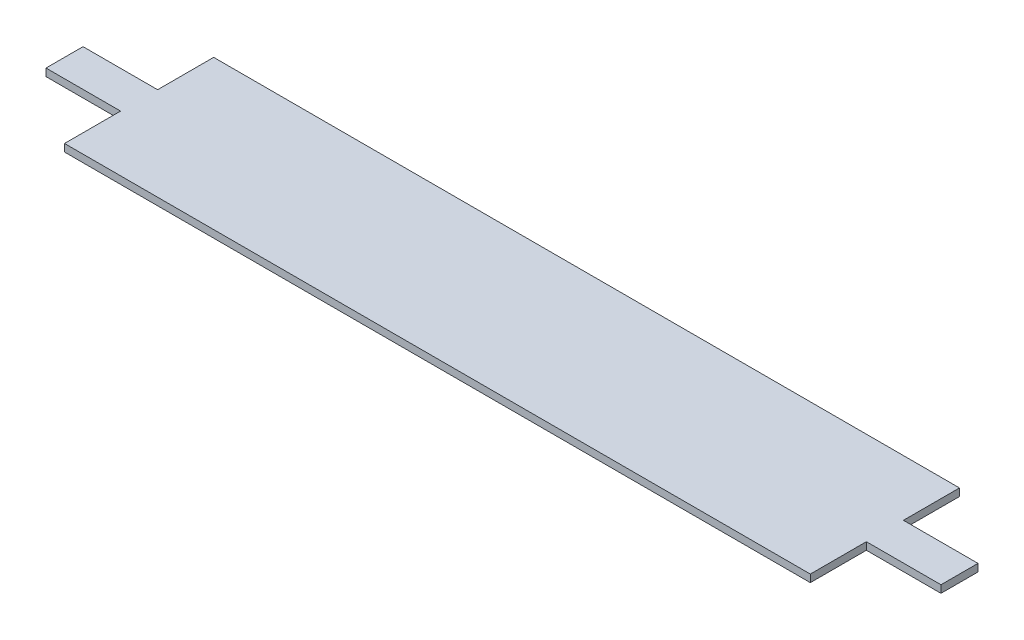
ISO-10303-21;
HEADER;
FILE_DESCRIPTION(('STEP AP214'),'2;1');
FILE_NAME('part.step','',(''),(''),'','','');
FILE_SCHEMA(('AUTOMOTIVE_DESIGN { 1 0 10303 214 1 1 1 1 }'));
ENDSEC;
DATA;
#1=APPLICATION_CONTEXT('core data for automotive mechanical design processes');
#2=APPLICATION_PROTOCOL_DEFINITION('international standard','automotive_design',2000,#1);
#3=PRODUCT_CONTEXT('',#1,'mechanical');
#4=PRODUCT('Part','Part','',(#3));
#5=PRODUCT_RELATED_PRODUCT_CATEGORY('part','',(#4));
#6=PRODUCT_DEFINITION_FORMATION('','',#4);
#7=PRODUCT_DEFINITION_CONTEXT('part definition',#1,'design');
#8=PRODUCT_DEFINITION('design','',#6,#7);
#9=PRODUCT_DEFINITION_SHAPE('','',#8);
#10=(LENGTH_UNIT() NAMED_UNIT(*) SI_UNIT(.MILLI.,.METRE.));
#11=(NAMED_UNIT(*) PLANE_ANGLE_UNIT() SI_UNIT($,.RADIAN.));
#12=(NAMED_UNIT(*) SI_UNIT($,.STERADIAN.) SOLID_ANGLE_UNIT());
#13=UNCERTAINTY_MEASURE_WITH_UNIT(LENGTH_MEASURE(1.E-05),#10,'distance_accuracy_value','');
#14=(GEOMETRIC_REPRESENTATION_CONTEXT(3) GLOBAL_UNCERTAINTY_ASSIGNED_CONTEXT((#13)) GLOBAL_UNIT_ASSIGNED_CONTEXT((#10,
#11,#12)) REPRESENTATION_CONTEXT('',''));
#15=CARTESIAN_POINT('',(0.,0.,0.));
#16=DIRECTION('',(0.,0.,1.));
#17=DIRECTION('',(1.,0.,0.));
#18=AXIS2_PLACEMENT_3D('',#15,#16,#17);
#19=CARTESIAN_POINT('',(25.,0.5,-5.));
#20=DIRECTION('',(0.,0.,1.));
#21=DIRECTION('',(1.,0.,0.));
#22=AXIS2_PLACEMENT_3D('',#19,#20,#21);
#23=PLANE('',#22);
#24=DIRECTION('',(-1.,0.,0.));
#25=VECTOR('',#24,1.);
#26=CARTESIAN_POINT('',(25.,0.,-5.));
#27=LINE('',#26,#25);
#28=CARTESIAN_POINT('',(25.,0.,-5.));
#29=VERTEX_POINT('',#28);
#30=CARTESIAN_POINT('',(-25.,0.,-4.99999999999999));
#31=VERTEX_POINT('',#30);
#32=EDGE_CURVE('E153',#29,#31,#27,.T.);
#33=ORIENTED_EDGE('',*,*,#32,.T.);
#34=DIRECTION('',(0.,-1.,0.));
#35=VECTOR('',#34,1.);
#36=CARTESIAN_POINT('',(-25.,0.5,-4.99999999999999));
#37=LINE('',#36,#35);
#38=CARTESIAN_POINT('',(-25.,0.5,-4.99999999999999));
#39=VERTEX_POINT('',#38);
#40=EDGE_CURVE('E11',#39,#31,#37,.T.);
#41=ORIENTED_EDGE('',*,*,#40,.F.);
#42=DIRECTION('',(-1.,0.,0.));
#43=VECTOR('',#42,1.);
#44=CARTESIAN_POINT('',(25.,0.5,-5.));
#45=LINE('',#44,#43);
#46=CARTESIAN_POINT('',(25.,0.5,-5.));
#47=VERTEX_POINT('',#46);
#48=EDGE_CURVE('E175',#47,#39,#45,.T.);
#49=ORIENTED_EDGE('',*,*,#48,.F.);
#50=DIRECTION('',(0.,-1.,0.));
#51=VECTOR('',#50,1.);
#52=CARTESIAN_POINT('',(25.,0.5,-5.));
#53=LINE('',#52,#51);
#54=EDGE_CURVE('E149',#47,#29,#53,.T.);
#55=ORIENTED_EDGE('',*,*,#54,.T.);
#56=EDGE_LOOP('',(#33,#41,#49,#55));
#57=FACE_BOUND('',#56,.T.);
#58=ADVANCED_FACE('F33',(#57),#23,.F.);
#59=CARTESIAN_POINT('',(-25.,0.5,-1.24120089325405));
#60=DIRECTION('',(1.,0.,0.));
#61=DIRECTION('',(0.,0.,-1.));
#62=AXIS2_PLACEMENT_3D('',#59,#60,#61);
#63=PLANE('',#62);
#64=DIRECTION('',(0.,0.,1.));
#65=VECTOR('',#64,1.);
#66=CARTESIAN_POINT('',(-25.,0.,-1.24120089325405));
#67=LINE('',#66,#65);
#68=CARTESIAN_POINT('',(-25.,0.,-1.24120089325405));
#69=VERTEX_POINT('',#68);
#70=EDGE_CURVE('E156',#31,#69,#67,.T.);
#71=ORIENTED_EDGE('',*,*,#70,.T.);
#72=DIRECTION('',(0.,-1.,0.));
#73=VECTOR('',#72,1.);
#74=CARTESIAN_POINT('',(-25.,0.5,-1.24120089325405));
#75=LINE('',#74,#73);
#76=CARTESIAN_POINT('',(-25.,0.5,-1.24120089325405));
#77=VERTEX_POINT('',#76);
#78=EDGE_CURVE('E41',#77,#69,#75,.T.);
#79=ORIENTED_EDGE('',*,*,#78,.F.);
#80=DIRECTION('',(0.,0.,1.));
#81=VECTOR('',#80,1.);
#82=CARTESIAN_POINT('',(-25.,0.5,-1.24120089325405));
#83=LINE('',#82,#81);
#84=EDGE_CURVE('E104',#39,#77,#83,.T.);
#85=ORIENTED_EDGE('',*,*,#84,.F.);
#86=ORIENTED_EDGE('',*,*,#40,.T.);
#87=EDGE_LOOP('',(#71,#79,#85,#86));
#88=FACE_BOUND('',#87,.T.);
#89=ADVANCED_FACE('F253',(#88),#63,.F.);
#90=CARTESIAN_POINT('',(-30.,0.5,-1.24120089325405));
#91=DIRECTION('',(0.,0.,1.));
#92=DIRECTION('',(1.,0.,0.));
#93=AXIS2_PLACEMENT_3D('',#90,#91,#92);
#94=PLANE('',#93);
#95=DIRECTION('',(-1.,0.,0.));
#96=VECTOR('',#95,1.);
#97=CARTESIAN_POINT('',(-30.,0.,-1.24120089325405));
#98=LINE('',#97,#96);
#99=CARTESIAN_POINT('',(-30.,0.,-1.24120089325405));
#100=VERTEX_POINT('',#99);
#101=EDGE_CURVE('E158',#69,#100,#98,.T.);
#102=ORIENTED_EDGE('',*,*,#101,.T.);
#103=DIRECTION('',(0.,-1.,0.));
#104=VECTOR('',#103,1.);
#105=CARTESIAN_POINT('',(-30.,0.5,-1.24120089325405));
#106=LINE('',#105,#104);
#107=CARTESIAN_POINT('',(-30.,0.5,-1.24120089325405));
#108=VERTEX_POINT('',#107);
#109=EDGE_CURVE('E194',#108,#100,#106,.T.);
#110=ORIENTED_EDGE('',*,*,#109,.F.);
#111=DIRECTION('',(-1.,0.,0.));
#112=VECTOR('',#111,1.);
#113=CARTESIAN_POINT('',(-30.,0.5,-1.24120089325405));
#114=LINE('',#113,#112);
#115=EDGE_CURVE('E202',#77,#108,#114,.T.);
#116=ORIENTED_EDGE('',*,*,#115,.F.);
#117=ORIENTED_EDGE('',*,*,#78,.T.);
#118=EDGE_LOOP('',(#102,#110,#116,#117));
#119=FACE_BOUND('',#118,.T.);
#120=ADVANCED_FACE('F200',(#119),#94,.F.);
#121=CARTESIAN_POINT('',(-30.,0.5,1.24120089325406));
#122=DIRECTION('',(1.,0.,0.));
#123=DIRECTION('',(0.,0.,-1.));
#124=AXIS2_PLACEMENT_3D('',#121,#122,#123);
#125=PLANE('',#124);
#126=DIRECTION('',(0.,0.,1.));
#127=VECTOR('',#126,1.);
#128=CARTESIAN_POINT('',(-30.,0.,1.24120089325406));
#129=LINE('',#128,#127);
#130=CARTESIAN_POINT('',(-30.,0.,1.24120089325406));
#131=VERTEX_POINT('',#130);
#132=EDGE_CURVE('E160',#100,#131,#129,.T.);
#133=ORIENTED_EDGE('',*,*,#132,.T.);
#134=DIRECTION('',(0.,-1.,0.));
#135=VECTOR('',#134,1.);
#136=CARTESIAN_POINT('',(-30.,0.5,1.24120089325406));
#137=LINE('',#136,#135);
#138=CARTESIAN_POINT('',(-30.,0.5,1.24120089325406));
#139=VERTEX_POINT('',#138);
#140=EDGE_CURVE('E191',#139,#131,#137,.T.);
#141=ORIENTED_EDGE('',*,*,#140,.F.);
#142=DIRECTION('',(0.,0.,1.));
#143=VECTOR('',#142,1.);
#144=CARTESIAN_POINT('',(-30.,0.5,1.24120089325406));
#145=LINE('',#144,#143);
#146=EDGE_CURVE('E220',#108,#139,#145,.T.);
#147=ORIENTED_EDGE('',*,*,#146,.F.);
#148=ORIENTED_EDGE('',*,*,#109,.T.);
#149=EDGE_LOOP('',(#133,#141,#147,#148));
#150=FACE_BOUND('',#149,.T.);
#151=ADVANCED_FACE('F211',(#150),#125,.F.);
#152=CARTESIAN_POINT('',(-30.,0.5,1.24120089325406));
#153=DIRECTION('',(0.,0.,-1.));
#154=DIRECTION('',(-1.,0.,0.));
#155=AXIS2_PLACEMENT_3D('',#152,#153,#154);
#156=PLANE('',#155);
#157=DIRECTION('',(1.,0.,0.));
#158=VECTOR('',#157,1.);
#159=CARTESIAN_POINT('',(-30.,0.,1.24120089325406));
#160=LINE('',#159,#158);
#161=CARTESIAN_POINT('',(-25.,0.,1.24120089325406));
#162=VERTEX_POINT('',#161);
#163=EDGE_CURVE('E162',#131,#162,#160,.T.);
#164=ORIENTED_EDGE('',*,*,#163,.T.);
#165=DIRECTION('',(0.,-1.,0.));
#166=VECTOR('',#165,1.);
#167=CARTESIAN_POINT('',(-25.,0.5,1.24120089325406));
#168=LINE('',#167,#166);
#169=CARTESIAN_POINT('',(-25.,0.5,1.24120089325406));
#170=VERTEX_POINT('',#169);
#171=EDGE_CURVE('E188',#170,#162,#168,.T.);
#172=ORIENTED_EDGE('',*,*,#171,.F.);
#173=DIRECTION('',(1.,0.,0.));
#174=VECTOR('',#173,1.);
#175=CARTESIAN_POINT('',(-30.,0.5,1.24120089325406));
#176=LINE('',#175,#174);
#177=EDGE_CURVE('E217',#139,#170,#176,.T.);
#178=ORIENTED_EDGE('',*,*,#177,.F.);
#179=ORIENTED_EDGE('',*,*,#140,.T.);
#180=EDGE_LOOP('',(#164,#172,#178,#179));
#181=FACE_BOUND('',#180,.T.);
#182=ADVANCED_FACE('F215',(#181),#156,.F.);
#183=CARTESIAN_POINT('',(-25.,0.5,5.));
#184=DIRECTION('',(1.,0.,0.));
#185=DIRECTION('',(0.,0.,-1.));
#186=AXIS2_PLACEMENT_3D('',#183,#184,#185);
#187=PLANE('',#186);
#188=DIRECTION('',(0.,0.,1.));
#189=VECTOR('',#188,1.);
#190=CARTESIAN_POINT('',(-25.,0.,5.));
#191=LINE('',#190,#189);
#192=CARTESIAN_POINT('',(-25.,0.,5.));
#193=VERTEX_POINT('',#192);
#194=EDGE_CURVE('E164',#162,#193,#191,.T.);
#195=ORIENTED_EDGE('',*,*,#194,.T.);
#196=DIRECTION('',(0.,-1.,0.));
#197=VECTOR('',#196,1.);
#198=CARTESIAN_POINT('',(-25.,0.5,5.));
#199=LINE('',#198,#197);
#200=CARTESIAN_POINT('',(-25.,0.5,5.));
#201=VERTEX_POINT('',#200);
#202=EDGE_CURVE('E185',#201,#193,#199,.T.);
#203=ORIENTED_EDGE('',*,*,#202,.F.);
#204=DIRECTION('',(0.,0.,1.));
#205=VECTOR('',#204,1.);
#206=CARTESIAN_POINT('',(-25.,0.5,5.));
#207=LINE('',#206,#205);
#208=EDGE_CURVE('E219',#170,#201,#207,.T.);
#209=ORIENTED_EDGE('',*,*,#208,.F.);
#210=ORIENTED_EDGE('',*,*,#171,.T.);
#211=EDGE_LOOP('',(#195,#203,#209,#210));
#212=FACE_BOUND('',#211,.T.);
#213=ADVANCED_FACE('F266',(#212),#187,.F.);
#214=CARTESIAN_POINT('',(25.,0.5,5.));
#215=DIRECTION('',(0.,0.,-1.));
#216=DIRECTION('',(-1.,0.,0.));
#217=AXIS2_PLACEMENT_3D('',#214,#215,#216);
#218=PLANE('',#217);
#219=DIRECTION('',(1.,0.,0.));
#220=VECTOR('',#219,1.);
#221=CARTESIAN_POINT('',(25.,0.,5.));
#222=LINE('',#221,#220);
#223=CARTESIAN_POINT('',(25.,0.,5.));
#224=VERTEX_POINT('',#223);
#225=EDGE_CURVE('E166',#193,#224,#222,.T.);
#226=ORIENTED_EDGE('',*,*,#225,.T.);
#227=DIRECTION('',(0.,-1.,0.));
#228=VECTOR('',#227,1.);
#229=CARTESIAN_POINT('',(25.,0.5,5.));
#230=LINE('',#229,#228);
#231=CARTESIAN_POINT('',(25.,0.5,5.));
#232=VERTEX_POINT('',#231);
#233=EDGE_CURVE('E182',#232,#224,#230,.T.);
#234=ORIENTED_EDGE('',*,*,#233,.F.);
#235=DIRECTION('',(1.,0.,0.));
#236=VECTOR('',#235,1.);
#237=CARTESIAN_POINT('',(25.,0.5,5.));
#238=LINE('',#237,#236);
#239=EDGE_CURVE('E222',#201,#232,#238,.T.);
#240=ORIENTED_EDGE('',*,*,#239,.F.);
#241=ORIENTED_EDGE('',*,*,#202,.T.);
#242=EDGE_LOOP('',(#226,#234,#240,#241));
#243=FACE_BOUND('',#242,.T.);
#244=ADVANCED_FACE('F269',(#243),#218,.F.);
#245=CARTESIAN_POINT('',(25.,0.5,5.));
#246=DIRECTION('',(-1.,0.,0.));
#247=DIRECTION('',(0.,0.,1.));
#248=AXIS2_PLACEMENT_3D('',#245,#246,#247);
#249=PLANE('',#248);
#250=DIRECTION('',(0.,0.,-1.));
#251=VECTOR('',#250,1.);
#252=CARTESIAN_POINT('',(25.,0.,5.));
#253=LINE('',#252,#251);
#254=CARTESIAN_POINT('',(25.,0.,1.24120089325406));
#255=VERTEX_POINT('',#254);
#256=EDGE_CURVE('E168',#224,#255,#253,.T.);
#257=ORIENTED_EDGE('',*,*,#256,.T.);
#258=DIRECTION('',(0.,-1.,0.));
#259=VECTOR('',#258,1.);
#260=CARTESIAN_POINT('',(25.,0.5,1.24120089325406));
#261=LINE('',#260,#259);
#262=CARTESIAN_POINT('',(25.,0.5,1.24120089325406));
#263=VERTEX_POINT('',#262);
#264=EDGE_CURVE('E179',#263,#255,#261,.T.);
#265=ORIENTED_EDGE('',*,*,#264,.F.);
#266=DIRECTION('',(0.,0.,-1.));
#267=VECTOR('',#266,1.);
#268=CARTESIAN_POINT('',(25.,0.5,5.));
#269=LINE('',#268,#267);
#270=EDGE_CURVE('E228',#232,#263,#269,.T.);
#271=ORIENTED_EDGE('',*,*,#270,.F.);
#272=ORIENTED_EDGE('',*,*,#233,.T.);
#273=EDGE_LOOP('',(#257,#265,#271,#272));
#274=FACE_BOUND('',#273,.T.);
#275=ADVANCED_FACE('F234',(#274),#249,.F.);
#276=CARTESIAN_POINT('',(25.,0.5,1.24120089325406));
#277=DIRECTION('',(0.,0.,-1.));
#278=DIRECTION('',(-1.,0.,0.));
#279=AXIS2_PLACEMENT_3D('',#276,#277,#278);
#280=PLANE('',#279);
#281=DIRECTION('',(1.,0.,0.));
#282=VECTOR('',#281,1.);
#283=CARTESIAN_POINT('',(25.,0.,1.24120089325406));
#284=LINE('',#283,#282);
#285=CARTESIAN_POINT('',(30.,0.,1.24120089325406));
#286=VERTEX_POINT('',#285);
#287=EDGE_CURVE('E170',#255,#286,#284,.T.);
#288=ORIENTED_EDGE('',*,*,#287,.T.);
#289=DIRECTION('',(0.,-1.,0.));
#290=VECTOR('',#289,1.);
#291=CARTESIAN_POINT('',(30.,0.5,1.24120089325406));
#292=LINE('',#291,#290);
#293=CARTESIAN_POINT('',(30.,0.5,1.24120089325406));
#294=VERTEX_POINT('',#293);
#295=EDGE_CURVE('E144',#294,#286,#292,.T.);
#296=ORIENTED_EDGE('',*,*,#295,.F.);
#297=DIRECTION('',(1.,0.,0.));
#298=VECTOR('',#297,1.);
#299=CARTESIAN_POINT('',(25.,0.5,1.24120089325406));
#300=LINE('',#299,#298);
#301=EDGE_CURVE('E135',#263,#294,#300,.T.);
#302=ORIENTED_EDGE('',*,*,#301,.F.);
#303=ORIENTED_EDGE('',*,*,#264,.T.);
#304=EDGE_LOOP('',(#288,#296,#302,#303));
#305=FACE_BOUND('',#304,.T.);
#306=ADVANCED_FACE('F238',(#305),#280,.F.);
#307=CARTESIAN_POINT('',(30.,0.5,1.24120089325406));
#308=DIRECTION('',(-1.,0.,0.));
#309=DIRECTION('',(0.,0.,1.));
#310=AXIS2_PLACEMENT_3D('',#307,#308,#309);
#311=PLANE('',#310);
#312=DIRECTION('',(0.,0.,-1.));
#313=VECTOR('',#312,1.);
#314=CARTESIAN_POINT('',(30.,0.,1.24120089325406));
#315=LINE('',#314,#313);
#316=CARTESIAN_POINT('',(30.,0.,-1.24120089325405));
#317=VERTEX_POINT('',#316);
#318=EDGE_CURVE('E143',#286,#317,#315,.T.);
#319=ORIENTED_EDGE('',*,*,#318,.T.);
#320=DIRECTION('',(0.,-1.,0.));
#321=VECTOR('',#320,1.);
#322=CARTESIAN_POINT('',(30.,0.5,-1.24120089325405));
#323=LINE('',#322,#321);
#324=CARTESIAN_POINT('',(30.,0.5,-1.24120089325405));
#325=VERTEX_POINT('',#324);
#326=EDGE_CURVE('E140',#325,#317,#323,.T.);
#327=ORIENTED_EDGE('',*,*,#326,.F.);
#328=DIRECTION('',(0.,0.,-1.));
#329=VECTOR('',#328,1.);
#330=CARTESIAN_POINT('',(30.,0.5,1.24120089325406));
#331=LINE('',#330,#329);
#332=EDGE_CURVE('E129',#294,#325,#331,.T.);
#333=ORIENTED_EDGE('',*,*,#332,.F.);
#334=ORIENTED_EDGE('',*,*,#295,.T.);
#335=EDGE_LOOP('',(#319,#327,#333,#334));
#336=FACE_BOUND('',#335,.T.);
#337=ADVANCED_FACE('F141',(#336),#311,.F.);
#338=CARTESIAN_POINT('',(25.,0.5,-1.24120089325405));
#339=DIRECTION('',(0.,0.,1.));
#340=DIRECTION('',(1.,0.,0.));
#341=AXIS2_PLACEMENT_3D('',#338,#339,#340);
#342=PLANE('',#341);
#343=DIRECTION('',(-1.,0.,0.));
#344=VECTOR('',#343,1.);
#345=CARTESIAN_POINT('',(25.,0.,-1.24120089325405));
#346=LINE('',#345,#344);
#347=CARTESIAN_POINT('',(25.,0.,-1.24120089325405));
#348=VERTEX_POINT('',#347);
#349=EDGE_CURVE('E90',#317,#348,#346,.T.);
#350=ORIENTED_EDGE('',*,*,#349,.T.);
#351=DIRECTION('',(0.,-1.,0.));
#352=VECTOR('',#351,1.);
#353=CARTESIAN_POINT('',(25.,0.5,-1.24120089325405));
#354=LINE('',#353,#352);
#355=CARTESIAN_POINT('',(25.,0.5,-1.24120089325405));
#356=VERTEX_POINT('',#355);
#357=EDGE_CURVE('E145',#356,#348,#354,.T.);
#358=ORIENTED_EDGE('',*,*,#357,.F.);
#359=DIRECTION('',(-1.,0.,0.));
#360=VECTOR('',#359,1.);
#361=CARTESIAN_POINT('',(25.,0.5,-1.24120089325405));
#362=LINE('',#361,#360);
#363=EDGE_CURVE('E133',#325,#356,#362,.T.);
#364=ORIENTED_EDGE('',*,*,#363,.F.);
#365=ORIENTED_EDGE('',*,*,#326,.T.);
#366=EDGE_LOOP('',(#350,#358,#364,#365));
#367=FACE_BOUND('',#366,.T.);
#368=ADVANCED_FACE('F147',(#367),#342,.F.);
#369=CARTESIAN_POINT('',(25.,0.5,-1.24120089325405));
#370=DIRECTION('',(-1.,0.,0.));
#371=DIRECTION('',(0.,0.,1.));
#372=AXIS2_PLACEMENT_3D('',#369,#370,#371);
#373=PLANE('',#372);
#374=DIRECTION('',(0.,0.,-1.));
#375=VECTOR('',#374,1.);
#376=CARTESIAN_POINT('',(25.,0.,-1.24120089325405));
#377=LINE('',#376,#375);
#378=EDGE_CURVE('E96',#348,#29,#377,.T.);
#379=ORIENTED_EDGE('',*,*,#378,.T.);
#380=ORIENTED_EDGE('',*,*,#54,.F.);
#381=DIRECTION('',(0.,0.,-1.));
#382=VECTOR('',#381,1.);
#383=CARTESIAN_POINT('',(25.,0.5,-1.24120089325405));
#384=LINE('',#383,#382);
#385=EDGE_CURVE('E49',#356,#47,#384,.T.);
#386=ORIENTED_EDGE('',*,*,#385,.F.);
#387=ORIENTED_EDGE('',*,*,#357,.T.);
#388=EDGE_LOOP('',(#379,#380,#386,#387));
#389=FACE_BOUND('',#388,.T.);
#390=ADVANCED_FACE('F242',(#389),#373,.F.);
#391=CARTESIAN_POINT('',(0.,0.5,0.));
#392=DIRECTION('',(0.,-1.,0.));
#393=DIRECTION('',(0.,0.,-1.));
#394=AXIS2_PLACEMENT_3D('',#391,#392,#393);
#395=PLANE('',#394);
#396=ORIENTED_EDGE('',*,*,#48,.T.);
#397=ORIENTED_EDGE('',*,*,#84,.T.);
#398=ORIENTED_EDGE('',*,*,#115,.T.);
#399=ORIENTED_EDGE('',*,*,#146,.T.);
#400=ORIENTED_EDGE('',*,*,#177,.T.);
#401=ORIENTED_EDGE('',*,*,#208,.T.);
#402=ORIENTED_EDGE('',*,*,#239,.T.);
#403=ORIENTED_EDGE('',*,*,#270,.T.);
#404=ORIENTED_EDGE('',*,*,#301,.T.);
#405=ORIENTED_EDGE('',*,*,#332,.T.);
#406=ORIENTED_EDGE('',*,*,#363,.T.);
#407=ORIENTED_EDGE('',*,*,#385,.T.);
#408=EDGE_LOOP('',(#396,#397,#398,#399,#400,#401,#402,#403,#404,#405,#406,#407));
#409=FACE_BOUND('',#408,.T.);
#410=ADVANCED_FACE('F131',(#409),#395,.F.);
#411=CARTESIAN_POINT('',(0.,0.,0.));
#412=DIRECTION('',(0.,-1.,0.));
#413=DIRECTION('',(0.,0.,-1.));
#414=AXIS2_PLACEMENT_3D('',#411,#412,#413);
#415=PLANE('',#414);
#416=ORIENTED_EDGE('',*,*,#32,.F.);
#417=ORIENTED_EDGE('',*,*,#378,.F.);
#418=ORIENTED_EDGE('',*,*,#349,.F.);
#419=ORIENTED_EDGE('',*,*,#318,.F.);
#420=ORIENTED_EDGE('',*,*,#287,.F.);
#421=ORIENTED_EDGE('',*,*,#256,.F.);
#422=ORIENTED_EDGE('',*,*,#225,.F.);
#423=ORIENTED_EDGE('',*,*,#194,.F.);
#424=ORIENTED_EDGE('',*,*,#163,.F.);
#425=ORIENTED_EDGE('',*,*,#132,.F.);
#426=ORIENTED_EDGE('',*,*,#101,.F.);
#427=ORIENTED_EDGE('',*,*,#70,.F.);
#428=EDGE_LOOP('',(#416,#417,#418,#419,#420,#421,#422,#423,#424,#425,#426,#427));
#429=FACE_BOUND('',#428,.T.);
#430=ADVANCED_FACE('F206',(#429),#415,.T.);
#431=CLOSED_SHELL('',(#58,#89,#120,#151,#182,#213,#244,#275,#306,#337,#368,#390,#410,#430));
#432=MANIFOLD_SOLID_BREP('B2',#431);
#433=ADVANCED_BREP_SHAPE_REPRESENTATION('',(#18,#432),#14);
#434=SHAPE_DEFINITION_REPRESENTATION(#9,#433);
ENDSEC;
END-ISO-10303-21;
